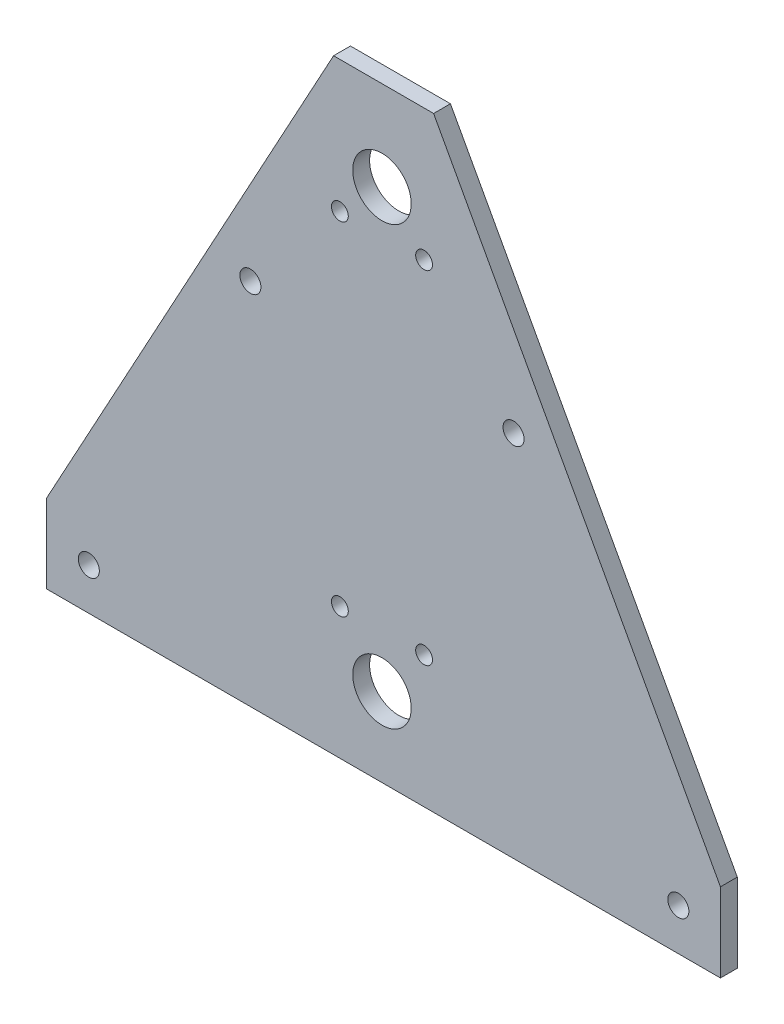
ISO-10303-21;
HEADER;
FILE_DESCRIPTION(('STEP AP214'),'2;1');
FILE_NAME('part.step','',(''),(''),'','','');
FILE_SCHEMA(('AUTOMOTIVE_DESIGN { 1 0 10303 214 1 1 1 1 }'));
ENDSEC;
DATA;
#1=APPLICATION_CONTEXT('core data for automotive mechanical design processes');
#2=APPLICATION_PROTOCOL_DEFINITION('international standard','automotive_design',2000,#1);
#3=PRODUCT_CONTEXT('',#1,'mechanical');
#4=PRODUCT('Part','Part','',(#3));
#5=PRODUCT_RELATED_PRODUCT_CATEGORY('part','',(#4));
#6=PRODUCT_DEFINITION_FORMATION('','',#4);
#7=PRODUCT_DEFINITION_CONTEXT('part definition',#1,'design');
#8=PRODUCT_DEFINITION('design','',#6,#7);
#9=PRODUCT_DEFINITION_SHAPE('','',#8);
#10=(LENGTH_UNIT() NAMED_UNIT(*) SI_UNIT(.MILLI.,.METRE.));
#11=(NAMED_UNIT(*) PLANE_ANGLE_UNIT() SI_UNIT($,.RADIAN.));
#12=(NAMED_UNIT(*) SI_UNIT($,.STERADIAN.) SOLID_ANGLE_UNIT());
#13=UNCERTAINTY_MEASURE_WITH_UNIT(LENGTH_MEASURE(1.E-05),#10,'distance_accuracy_value','');
#14=(GEOMETRIC_REPRESENTATION_CONTEXT(3) GLOBAL_UNCERTAINTY_ASSIGNED_CONTEXT((#13)) GLOBAL_UNIT_ASSIGNED_CONTEXT((#10,
#11,#12)) REPRESENTATION_CONTEXT('',''));
#15=CARTESIAN_POINT('',(0.,0.,0.));
#16=DIRECTION('',(0.,0.,1.));
#17=DIRECTION('',(1.,0.,0.));
#18=AXIS2_PLACEMENT_3D('',#15,#16,#17);
#19=CARTESIAN_POINT('',(0.,0.,16.));
#20=DIRECTION('',(0.,0.,1.));
#21=DIRECTION('',(1.,0.,0.));
#22=AXIS2_PLACEMENT_3D('',#19,#20,#21);
#23=PLANE('',#22);
#24=CARTESIAN_POINT('',(40.,39.7649052208436,16.));
#25=DIRECTION('',(0.,0.,1.));
#26=DIRECTION('',(1.,0.,0.));
#27=AXIS2_PLACEMENT_3D('',#24,#25,#26);
#28=CIRCLE('',#27,10.);
#29=CARTESIAN_POINT('',(50.,39.7649052208436,16.));
#30=VERTEX_POINT('',#29);
#31=EDGE_CURVE('E217',#30,#30,#28,.T.);
#32=ORIENTED_EDGE('',*,*,#31,.F.);
#33=EDGE_LOOP('',(#32));
#34=FACE_BOUND('',#33,.T.);
#35=CARTESIAN_POINT('',(358.476326100277,125.024449421026,16.));
#36=DIRECTION('',(0.,0.,1.));
#37=DIRECTION('',(1.,0.,0.));
#38=AXIS2_PLACEMENT_3D('',#35,#36,#37);
#39=CIRCLE('',#38,7.99999999999999);
#40=CARTESIAN_POINT('',(366.476326100277,125.024449421026,16.));
#41=VERTEX_POINT('',#40);
#42=EDGE_CURVE('E229',#41,#41,#39,.T.);
#43=ORIENTED_EDGE('',*,*,#42,.F.);
#44=EDGE_LOOP('',(#43));
#45=FACE_BOUND('',#44,.T.);
#46=CARTESIAN_POINT('',(443.476326100277,350.,16.));
#47=DIRECTION('',(0.,0.,1.));
#48=DIRECTION('',(1.,0.,0.));
#49=AXIS2_PLACEMENT_3D('',#46,#47,#48);
#50=CIRCLE('',#49,10.);
#51=CARTESIAN_POINT('',(453.476326100277,350.,16.));
#52=VERTEX_POINT('',#51);
#53=EDGE_CURVE('E241',#52,#52,#50,.T.);
#54=ORIENTED_EDGE('',*,*,#53,.F.);
#55=EDGE_LOOP('',(#54));
#56=FACE_BOUND('',#55,.T.);
#57=CARTESIAN_POINT('',(358.476326100277,450.,16.));
#58=DIRECTION('',(0.,0.,1.));
#59=DIRECTION('',(1.,0.,0.));
#60=AXIS2_PLACEMENT_3D('',#57,#58,#59);
#61=CIRCLE('',#60,7.99999999999999);
#62=CARTESIAN_POINT('',(366.476326100277,450.,16.));
#63=VERTEX_POINT('',#62);
#64=EDGE_CURVE('E253',#63,#63,#61,.T.);
#65=ORIENTED_EDGE('',*,*,#64,.F.);
#66=EDGE_LOOP('',(#65));
#67=FACE_BOUND('',#66,.T.);
#68=CARTESIAN_POINT('',(318.476326100277,490.,16.));
#69=DIRECTION('',(0.,0.,1.));
#70=DIRECTION('',(1.,0.,0.));
#71=AXIS2_PLACEMENT_3D('',#68,#69,#70);
#72=CIRCLE('',#71,27.775);
#73=CARTESIAN_POINT('',(346.251326100277,490.,16.));
#74=VERTEX_POINT('',#73);
#75=EDGE_CURVE('E126',#74,#74,#72,.T.);
#76=ORIENTED_EDGE('',*,*,#75,.F.);
#77=EDGE_LOOP('',(#76));
#78=FACE_BOUND('',#77,.T.);
#79=DIRECTION('',(0.,-1.,0.));
#80=VECTOR('',#79,1.);
#81=CARTESIAN_POINT('',(0.,75.,16.));
#82=LINE('',#81,#80);
#83=CARTESIAN_POINT('',(0.,75.,16.));
#84=VERTEX_POINT('',#83);
#85=CARTESIAN_POINT('',(0.,0.,16.));
#86=VERTEX_POINT('',#85);
#87=EDGE_CURVE('E133',#84,#86,#82,.T.);
#88=ORIENTED_EDGE('',*,*,#87,.T.);
#89=DIRECTION('',(1.,0.,0.));
#90=VECTOR('',#89,1.);
#91=CARTESIAN_POINT('',(0.,0.,16.));
#92=LINE('',#91,#90);
#93=CARTESIAN_POINT('',(640.,0.,16.));
#94=VERTEX_POINT('',#93);
#95=EDGE_CURVE('E91',#86,#94,#92,.T.);
#96=ORIENTED_EDGE('',*,*,#95,.T.);
#97=DIRECTION('',(0.,1.,0.));
#98=VECTOR('',#97,1.);
#99=CARTESIAN_POINT('',(640.,0.,16.));
#100=LINE('',#99,#98);
#101=CARTESIAN_POINT('',(640.,75.,16.));
#102=VERTEX_POINT('',#101);
#103=EDGE_CURVE('E104',#94,#102,#100,.T.);
#104=ORIENTED_EDGE('',*,*,#103,.T.);
#105=DIRECTION('',(-0.478530429270482,0.87807096994617,0.));
#106=VECTOR('',#105,1.);
#107=CARTESIAN_POINT('',(640.,75.,16.));
#108=LINE('',#107,#106);
#109=CARTESIAN_POINT('',(367.510391728463,575.,16.));
#110=VERTEX_POINT('',#109);
#111=EDGE_CURVE('E98',#102,#110,#108,.T.);
#112=ORIENTED_EDGE('',*,*,#111,.T.);
#113=DIRECTION('',(-1.,0.,0.));
#114=VECTOR('',#113,1.);
#115=CARTESIAN_POINT('',(367.510391728463,575.,16.));
#116=LINE('',#115,#114);
#117=CARTESIAN_POINT('',(272.510391728463,575.,16.));
#118=VERTEX_POINT('',#117);
#119=EDGE_CURVE('E102',#110,#118,#116,.T.);
#120=ORIENTED_EDGE('',*,*,#119,.T.);
#121=DIRECTION('',(-0.478558569346134,-0.878055633604945,0.));
#122=VECTOR('',#121,1.);
#123=CARTESIAN_POINT('',(272.510391728463,575.,16.));
#124=LINE('',#123,#122);
#125=EDGE_CURVE('E54',#118,#84,#124,.T.);
#126=ORIENTED_EDGE('',*,*,#125,.T.);
#127=EDGE_LOOP('',(#88,#96,#104,#112,#120,#126));
#128=FACE_BOUND('',#127,.T.);
#129=CARTESIAN_POINT('',(278.476326100277,450.,16.));
#130=DIRECTION('',(0.,0.,1.));
#131=DIRECTION('',(1.,0.,0.));
#132=AXIS2_PLACEMENT_3D('',#129,#130,#131);
#133=CIRCLE('',#132,7.99999999999999);
#134=CARTESIAN_POINT('',(286.476326100277,450.,16.));
#135=VERTEX_POINT('',#134);
#136=EDGE_CURVE('E259',#135,#135,#133,.T.);
#137=ORIENTED_EDGE('',*,*,#136,.F.);
#138=EDGE_LOOP('',(#137));
#139=FACE_BOUND('',#138,.T.);
#140=CARTESIAN_POINT('',(193.476326100277,350.,16.));
#141=DIRECTION('',(0.,0.,1.));
#142=DIRECTION('',(1.,0.,0.));
#143=AXIS2_PLACEMENT_3D('',#140,#141,#142);
#144=CIRCLE('',#143,10.);
#145=CARTESIAN_POINT('',(203.476326100277,350.,16.));
#146=VERTEX_POINT('',#145);
#147=EDGE_CURVE('E247',#146,#146,#144,.T.);
#148=ORIENTED_EDGE('',*,*,#147,.F.);
#149=EDGE_LOOP('',(#148));
#150=FACE_BOUND('',#149,.T.);
#151=CARTESIAN_POINT('',(278.476326100277,125.024449421026,16.));
#152=DIRECTION('',(0.,0.,1.));
#153=DIRECTION('',(1.,0.,0.));
#154=AXIS2_PLACEMENT_3D('',#151,#152,#153);
#155=CIRCLE('',#154,7.99999999999999);
#156=CARTESIAN_POINT('',(286.476326100277,125.024449421026,16.));
#157=VERTEX_POINT('',#156);
#158=EDGE_CURVE('E235',#157,#157,#155,.T.);
#159=ORIENTED_EDGE('',*,*,#158,.F.);
#160=EDGE_LOOP('',(#159));
#161=FACE_BOUND('',#160,.T.);
#162=CARTESIAN_POINT('',(318.476326100277,75.,16.));
#163=DIRECTION('',(0.,0.,1.));
#164=DIRECTION('',(1.,0.,0.));
#165=AXIS2_PLACEMENT_3D('',#162,#163,#164);
#166=CIRCLE('',#165,27.775);
#167=CARTESIAN_POINT('',(346.251326100277,75.,16.));
#168=VERTEX_POINT('',#167);
#169=EDGE_CURVE('E223',#168,#168,#166,.T.);
#170=ORIENTED_EDGE('',*,*,#169,.F.);
#171=EDGE_LOOP('',(#170));
#172=FACE_BOUND('',#171,.T.);
#173=CARTESIAN_POINT('',(600.,39.7649052208436,16.));
#174=DIRECTION('',(0.,0.,1.));
#175=DIRECTION('',(1.,0.,0.));
#176=AXIS2_PLACEMENT_3D('',#173,#174,#175);
#177=CIRCLE('',#176,9.99999999999998);
#178=CARTESIAN_POINT('',(610.,39.7649052208436,16.));
#179=VERTEX_POINT('',#178);
#180=EDGE_CURVE('E208',#179,#179,#177,.T.);
#181=ORIENTED_EDGE('',*,*,#180,.F.);
#182=EDGE_LOOP('',(#181));
#183=FACE_BOUND('',#182,.T.);
#184=ADVANCED_FACE('F37',(#34,#45,#56,#67,#78,#128,#139,#150,#161,#172,#183),#23,.T.);
#185=CARTESIAN_POINT('',(0.,0.,0.));
#186=DIRECTION('',(0.,0.,1.));
#187=DIRECTION('',(1.,0.,0.));
#188=AXIS2_PLACEMENT_3D('',#185,#186,#187);
#189=PLANE('',#188);
#190=DIRECTION('',(0.,-1.,0.));
#191=VECTOR('',#190,1.);
#192=CARTESIAN_POINT('',(0.,75.,0.));
#193=LINE('',#192,#191);
#194=CARTESIAN_POINT('',(0.,75.,0.));
#195=VERTEX_POINT('',#194);
#196=CARTESIAN_POINT('',(0.,0.,0.));
#197=VERTEX_POINT('',#196);
#198=EDGE_CURVE('E122',#195,#197,#193,.T.);
#199=ORIENTED_EDGE('',*,*,#198,.F.);
#200=DIRECTION('',(-0.478558569346134,-0.878055633604945,0.));
#201=VECTOR('',#200,1.);
#202=CARTESIAN_POINT('',(272.510391728463,575.,0.));
#203=LINE('',#202,#201);
#204=CARTESIAN_POINT('',(272.510391728463,575.,0.));
#205=VERTEX_POINT('',#204);
#206=EDGE_CURVE('E83',#205,#195,#203,.T.);
#207=ORIENTED_EDGE('',*,*,#206,.F.);
#208=DIRECTION('',(-1.,0.,0.));
#209=VECTOR('',#208,1.);
#210=CARTESIAN_POINT('',(367.510391728463,575.,0.));
#211=LINE('',#210,#209);
#212=CARTESIAN_POINT('',(367.510391728463,575.,0.));
#213=VERTEX_POINT('',#212);
#214=EDGE_CURVE('E77',#213,#205,#211,.T.);
#215=ORIENTED_EDGE('',*,*,#214,.F.);
#216=DIRECTION('',(-0.478530429270482,0.87807096994617,0.));
#217=VECTOR('',#216,1.);
#218=CARTESIAN_POINT('',(640.,75.,0.));
#219=LINE('',#218,#217);
#220=CARTESIAN_POINT('',(640.,75.,0.));
#221=VERTEX_POINT('',#220);
#222=EDGE_CURVE('E112',#221,#213,#219,.T.);
#223=ORIENTED_EDGE('',*,*,#222,.F.);
#224=DIRECTION('',(0.,1.,0.));
#225=VECTOR('',#224,1.);
#226=CARTESIAN_POINT('',(640.,0.,0.));
#227=LINE('',#226,#225);
#228=CARTESIAN_POINT('',(640.,0.,0.));
#229=VERTEX_POINT('',#228);
#230=EDGE_CURVE('E128',#229,#221,#227,.T.);
#231=ORIENTED_EDGE('',*,*,#230,.F.);
#232=DIRECTION('',(1.,0.,0.));
#233=VECTOR('',#232,1.);
#234=CARTESIAN_POINT('',(0.,0.,0.));
#235=LINE('',#234,#233);
#236=EDGE_CURVE('E125',#197,#229,#235,.T.);
#237=ORIENTED_EDGE('',*,*,#236,.F.);
#238=EDGE_LOOP('',(#199,#207,#215,#223,#231,#237));
#239=FACE_BOUND('',#238,.T.);
#240=CARTESIAN_POINT('',(318.476326100277,490.,0.));
#241=DIRECTION('',(0.,0.,1.));
#242=DIRECTION('',(1.,0.,0.));
#243=AXIS2_PLACEMENT_3D('',#240,#241,#242);
#244=CIRCLE('',#243,27.775);
#245=CARTESIAN_POINT('',(346.251326100277,490.,0.));
#246=VERTEX_POINT('',#245);
#247=EDGE_CURVE('E262',#246,#246,#244,.T.);
#248=ORIENTED_EDGE('',*,*,#247,.T.);
#249=EDGE_LOOP('',(#248));
#250=FACE_BOUND('',#249,.T.);
#251=CARTESIAN_POINT('',(278.476326100277,450.,0.));
#252=DIRECTION('',(0.,0.,1.));
#253=DIRECTION('',(1.,0.,0.));
#254=AXIS2_PLACEMENT_3D('',#251,#252,#253);
#255=CIRCLE('',#254,7.99999999999999);
#256=CARTESIAN_POINT('',(286.476326100277,450.,0.));
#257=VERTEX_POINT('',#256);
#258=EDGE_CURVE('E256',#257,#257,#255,.T.);
#259=ORIENTED_EDGE('',*,*,#258,.T.);
#260=EDGE_LOOP('',(#259));
#261=FACE_BOUND('',#260,.T.);
#262=CARTESIAN_POINT('',(358.476326100277,450.,0.));
#263=DIRECTION('',(0.,0.,1.));
#264=DIRECTION('',(1.,0.,0.));
#265=AXIS2_PLACEMENT_3D('',#262,#263,#264);
#266=CIRCLE('',#265,7.99999999999999);
#267=CARTESIAN_POINT('',(366.476326100277,450.,0.));
#268=VERTEX_POINT('',#267);
#269=EDGE_CURVE('E250',#268,#268,#266,.T.);
#270=ORIENTED_EDGE('',*,*,#269,.T.);
#271=EDGE_LOOP('',(#270));
#272=FACE_BOUND('',#271,.T.);
#273=CARTESIAN_POINT('',(193.476326100277,350.,0.));
#274=DIRECTION('',(0.,0.,1.));
#275=DIRECTION('',(1.,0.,0.));
#276=AXIS2_PLACEMENT_3D('',#273,#274,#275);
#277=CIRCLE('',#276,10.);
#278=CARTESIAN_POINT('',(203.476326100277,350.,0.));
#279=VERTEX_POINT('',#278);
#280=EDGE_CURVE('E244',#279,#279,#277,.T.);
#281=ORIENTED_EDGE('',*,*,#280,.T.);
#282=EDGE_LOOP('',(#281));
#283=FACE_BOUND('',#282,.T.);
#284=CARTESIAN_POINT('',(443.476326100277,350.,0.));
#285=DIRECTION('',(0.,0.,1.));
#286=DIRECTION('',(1.,0.,0.));
#287=AXIS2_PLACEMENT_3D('',#284,#285,#286);
#288=CIRCLE('',#287,10.);
#289=CARTESIAN_POINT('',(453.476326100277,350.,0.));
#290=VERTEX_POINT('',#289);
#291=EDGE_CURVE('E238',#290,#290,#288,.T.);
#292=ORIENTED_EDGE('',*,*,#291,.T.);
#293=EDGE_LOOP('',(#292));
#294=FACE_BOUND('',#293,.T.);
#295=CARTESIAN_POINT('',(278.476326100277,125.024449421026,0.));
#296=DIRECTION('',(0.,0.,1.));
#297=DIRECTION('',(1.,0.,0.));
#298=AXIS2_PLACEMENT_3D('',#295,#296,#297);
#299=CIRCLE('',#298,7.99999999999999);
#300=CARTESIAN_POINT('',(286.476326100277,125.024449421026,0.));
#301=VERTEX_POINT('',#300);
#302=EDGE_CURVE('E232',#301,#301,#299,.T.);
#303=ORIENTED_EDGE('',*,*,#302,.T.);
#304=EDGE_LOOP('',(#303));
#305=FACE_BOUND('',#304,.T.);
#306=CARTESIAN_POINT('',(358.476326100277,125.024449421026,0.));
#307=DIRECTION('',(0.,0.,1.));
#308=DIRECTION('',(1.,0.,0.));
#309=AXIS2_PLACEMENT_3D('',#306,#307,#308);
#310=CIRCLE('',#309,7.99999999999999);
#311=CARTESIAN_POINT('',(366.476326100277,125.024449421026,0.));
#312=VERTEX_POINT('',#311);
#313=EDGE_CURVE('E226',#312,#312,#310,.T.);
#314=ORIENTED_EDGE('',*,*,#313,.T.);
#315=EDGE_LOOP('',(#314));
#316=FACE_BOUND('',#315,.T.);
#317=CARTESIAN_POINT('',(318.476326100277,75.,0.));
#318=DIRECTION('',(0.,0.,1.));
#319=DIRECTION('',(1.,0.,0.));
#320=AXIS2_PLACEMENT_3D('',#317,#318,#319);
#321=CIRCLE('',#320,27.775);
#322=CARTESIAN_POINT('',(346.251326100277,75.,0.));
#323=VERTEX_POINT('',#322);
#324=EDGE_CURVE('E220',#323,#323,#321,.T.);
#325=ORIENTED_EDGE('',*,*,#324,.T.);
#326=EDGE_LOOP('',(#325));
#327=FACE_BOUND('',#326,.T.);
#328=CARTESIAN_POINT('',(40.,39.7649052208436,0.));
#329=DIRECTION('',(0.,0.,1.));
#330=DIRECTION('',(1.,0.,0.));
#331=AXIS2_PLACEMENT_3D('',#328,#329,#330);
#332=CIRCLE('',#331,10.);
#333=CARTESIAN_POINT('',(50.,39.7649052208436,0.));
#334=VERTEX_POINT('',#333);
#335=EDGE_CURVE('E214',#334,#334,#332,.T.);
#336=ORIENTED_EDGE('',*,*,#335,.T.);
#337=EDGE_LOOP('',(#336));
#338=FACE_BOUND('',#337,.T.);
#339=CARTESIAN_POINT('',(600.,39.7649052208436,0.));
#340=DIRECTION('',(0.,0.,1.));
#341=DIRECTION('',(1.,0.,0.));
#342=AXIS2_PLACEMENT_3D('',#339,#340,#341);
#343=CIRCLE('',#342,9.99999999999998);
#344=CARTESIAN_POINT('',(610.,39.7649052208436,0.));
#345=VERTEX_POINT('',#344);
#346=EDGE_CURVE('E211',#345,#345,#343,.T.);
#347=ORIENTED_EDGE('',*,*,#346,.T.);
#348=EDGE_LOOP('',(#347));
#349=FACE_BOUND('',#348,.T.);
#350=ADVANCED_FACE('F142',(#239,#250,#261,#272,#283,#294,#305,#316,#327,#338,#349),#189,.F.);
#351=CARTESIAN_POINT('',(0.,75.,16.));
#352=DIRECTION('',(1.,0.,0.));
#353=DIRECTION('',(0.,1.,0.));
#354=AXIS2_PLACEMENT_3D('',#351,#352,#353);
#355=PLANE('',#354);
#356=ORIENTED_EDGE('',*,*,#198,.T.);
#357=DIRECTION('',(0.,0.,-1.));
#358=VECTOR('',#357,1.);
#359=CARTESIAN_POINT('',(0.,0.,16.));
#360=LINE('',#359,#358);
#361=EDGE_CURVE('E11',#86,#197,#360,.T.);
#362=ORIENTED_EDGE('',*,*,#361,.F.);
#363=ORIENTED_EDGE('',*,*,#87,.F.);
#364=DIRECTION('',(0.,0.,-1.));
#365=VECTOR('',#364,1.);
#366=CARTESIAN_POINT('',(0.,75.,16.));
#367=LINE('',#366,#365);
#368=EDGE_CURVE('E118',#84,#195,#367,.T.);
#369=ORIENTED_EDGE('',*,*,#368,.T.);
#370=EDGE_LOOP('',(#356,#362,#363,#369));
#371=FACE_BOUND('',#370,.T.);
#372=ADVANCED_FACE('F39',(#371),#355,.F.);
#373=CARTESIAN_POINT('',(0.,0.,16.));
#374=DIRECTION('',(0.,1.,0.));
#375=DIRECTION('',(0.,0.,1.));
#376=AXIS2_PLACEMENT_3D('',#373,#374,#375);
#377=PLANE('',#376);
#378=ORIENTED_EDGE('',*,*,#236,.T.);
#379=DIRECTION('',(0.,0.,-1.));
#380=VECTOR('',#379,1.);
#381=CARTESIAN_POINT('',(640.,0.,16.));
#382=LINE('',#381,#380);
#383=EDGE_CURVE('E46',#94,#229,#382,.T.);
#384=ORIENTED_EDGE('',*,*,#383,.F.);
#385=ORIENTED_EDGE('',*,*,#95,.F.);
#386=ORIENTED_EDGE('',*,*,#361,.T.);
#387=EDGE_LOOP('',(#378,#384,#385,#386));
#388=FACE_BOUND('',#387,.T.);
#389=ADVANCED_FACE('F374',(#388),#377,.F.);
#390=CARTESIAN_POINT('',(640.,0.,16.));
#391=DIRECTION('',(-1.,0.,0.));
#392=DIRECTION('',(0.,0.,1.));
#393=AXIS2_PLACEMENT_3D('',#390,#391,#392);
#394=PLANE('',#393);
#395=ORIENTED_EDGE('',*,*,#230,.T.);
#396=DIRECTION('',(0.,0.,-1.));
#397=VECTOR('',#396,1.);
#398=CARTESIAN_POINT('',(640.,75.,16.));
#399=LINE('',#398,#397);
#400=EDGE_CURVE('E113',#102,#221,#399,.T.);
#401=ORIENTED_EDGE('',*,*,#400,.F.);
#402=ORIENTED_EDGE('',*,*,#103,.F.);
#403=ORIENTED_EDGE('',*,*,#383,.T.);
#404=EDGE_LOOP('',(#395,#401,#402,#403));
#405=FACE_BOUND('',#404,.T.);
#406=ADVANCED_FACE('F139',(#405),#394,.F.);
#407=CARTESIAN_POINT('',(640.,75.,16.));
#408=DIRECTION('',(-0.87807096994617,-0.478530429270482,0.));
#409=DIRECTION('',(0.478530429270482,-0.87807096994617,0.));
#410=AXIS2_PLACEMENT_3D('',#407,#408,#409);
#411=PLANE('',#410);
#412=ORIENTED_EDGE('',*,*,#222,.T.);
#413=DIRECTION('',(0.,0.,-1.));
#414=VECTOR('',#413,1.);
#415=CARTESIAN_POINT('',(367.510391728463,575.,16.));
#416=LINE('',#415,#414);
#417=EDGE_CURVE('E109',#110,#213,#416,.T.);
#418=ORIENTED_EDGE('',*,*,#417,.F.);
#419=ORIENTED_EDGE('',*,*,#111,.F.);
#420=ORIENTED_EDGE('',*,*,#400,.T.);
#421=EDGE_LOOP('',(#412,#418,#419,#420));
#422=FACE_BOUND('',#421,.T.);
#423=ADVANCED_FACE('F110',(#422),#411,.F.);
#424=CARTESIAN_POINT('',(367.510391728463,575.,16.));
#425=DIRECTION('',(0.,-1.,0.));
#426=DIRECTION('',(1.,0.,0.));
#427=AXIS2_PLACEMENT_3D('',#424,#425,#426);
#428=PLANE('',#427);
#429=ORIENTED_EDGE('',*,*,#214,.T.);
#430=DIRECTION('',(0.,0.,-1.));
#431=VECTOR('',#430,1.);
#432=CARTESIAN_POINT('',(272.510391728463,575.,16.));
#433=LINE('',#432,#431);
#434=EDGE_CURVE('E114',#118,#205,#433,.T.);
#435=ORIENTED_EDGE('',*,*,#434,.F.);
#436=ORIENTED_EDGE('',*,*,#119,.F.);
#437=ORIENTED_EDGE('',*,*,#417,.T.);
#438=EDGE_LOOP('',(#429,#435,#436,#437));
#439=FACE_BOUND('',#438,.T.);
#440=ADVANCED_FACE('F116',(#439),#428,.F.);
#441=CARTESIAN_POINT('',(272.510391728463,575.,16.));
#442=DIRECTION('',(0.878055633604945,-0.478558569346134,0.));
#443=DIRECTION('',(0.478558569346134,0.878055633604945,0.));
#444=AXIS2_PLACEMENT_3D('',#441,#442,#443);
#445=PLANE('',#444);
#446=ORIENTED_EDGE('',*,*,#206,.T.);
#447=ORIENTED_EDGE('',*,*,#368,.F.);
#448=ORIENTED_EDGE('',*,*,#125,.F.);
#449=ORIENTED_EDGE('',*,*,#434,.T.);
#450=EDGE_LOOP('',(#446,#447,#448,#449));
#451=FACE_BOUND('',#450,.T.);
#452=ADVANCED_FACE('F147',(#451),#445,.F.);
#453=CARTESIAN_POINT('',(318.476326100277,490.,16.));
#454=DIRECTION('',(0.,0.,-1.));
#455=DIRECTION('',(-1.,0.,0.));
#456=AXIS2_PLACEMENT_3D('',#453,#454,#455);
#457=CYLINDRICAL_SURFACE('',#456,27.775);
#458=ORIENTED_EDGE('',*,*,#75,.T.);
#459=EDGE_LOOP('',(#458));
#460=FACE_BOUND('',#459,.T.);
#461=ORIENTED_EDGE('',*,*,#247,.F.);
#462=EDGE_LOOP('',(#461));
#463=FACE_BOUND('',#462,.T.);
#464=ADVANCED_FACE('F149',(#460,#463),#457,.F.);
#465=CARTESIAN_POINT('',(278.476326100277,450.,16.));
#466=DIRECTION('',(0.,0.,-1.));
#467=DIRECTION('',(-1.,0.,0.));
#468=AXIS2_PLACEMENT_3D('',#465,#466,#467);
#469=CYLINDRICAL_SURFACE('',#468,7.99999999999999);
#470=ORIENTED_EDGE('',*,*,#136,.T.);
#471=EDGE_LOOP('',(#470));
#472=FACE_BOUND('',#471,.T.);
#473=ORIENTED_EDGE('',*,*,#258,.F.);
#474=EDGE_LOOP('',(#473));
#475=FACE_BOUND('',#474,.T.);
#476=ADVANCED_FACE('F155',(#472,#475),#469,.F.);
#477=CARTESIAN_POINT('',(358.476326100277,450.,16.));
#478=DIRECTION('',(0.,0.,-1.));
#479=DIRECTION('',(-1.,0.,0.));
#480=AXIS2_PLACEMENT_3D('',#477,#478,#479);
#481=CYLINDRICAL_SURFACE('',#480,7.99999999999999);
#482=ORIENTED_EDGE('',*,*,#64,.T.);
#483=EDGE_LOOP('',(#482));
#484=FACE_BOUND('',#483,.T.);
#485=ORIENTED_EDGE('',*,*,#269,.F.);
#486=EDGE_LOOP('',(#485));
#487=FACE_BOUND('',#486,.T.);
#488=ADVANCED_FACE('F171',(#484,#487),#481,.F.);
#489=CARTESIAN_POINT('',(193.476326100277,350.,16.));
#490=DIRECTION('',(0.,0.,-1.));
#491=DIRECTION('',(-1.,0.,0.));
#492=AXIS2_PLACEMENT_3D('',#489,#490,#491);
#493=CYLINDRICAL_SURFACE('',#492,10.);
#494=ORIENTED_EDGE('',*,*,#147,.T.);
#495=EDGE_LOOP('',(#494));
#496=FACE_BOUND('',#495,.T.);
#497=ORIENTED_EDGE('',*,*,#280,.F.);
#498=EDGE_LOOP('',(#497));
#499=FACE_BOUND('',#498,.T.);
#500=ADVANCED_FACE('F175',(#496,#499),#493,.F.);
#501=CARTESIAN_POINT('',(443.476326100277,350.,16.));
#502=DIRECTION('',(0.,0.,-1.));
#503=DIRECTION('',(-1.,0.,0.));
#504=AXIS2_PLACEMENT_3D('',#501,#502,#503);
#505=CYLINDRICAL_SURFACE('',#504,10.);
#506=ORIENTED_EDGE('',*,*,#53,.T.);
#507=EDGE_LOOP('',(#506));
#508=FACE_BOUND('',#507,.T.);
#509=ORIENTED_EDGE('',*,*,#291,.F.);
#510=EDGE_LOOP('',(#509));
#511=FACE_BOUND('',#510,.T.);
#512=ADVANCED_FACE('F179',(#508,#511),#505,.F.);
#513=CARTESIAN_POINT('',(278.476326100277,125.024449421026,16.));
#514=DIRECTION('',(0.,0.,-1.));
#515=DIRECTION('',(-1.,0.,0.));
#516=AXIS2_PLACEMENT_3D('',#513,#514,#515);
#517=CYLINDRICAL_SURFACE('',#516,7.99999999999999);
#518=ORIENTED_EDGE('',*,*,#158,.T.);
#519=EDGE_LOOP('',(#518));
#520=FACE_BOUND('',#519,.T.);
#521=ORIENTED_EDGE('',*,*,#302,.F.);
#522=EDGE_LOOP('',(#521));
#523=FACE_BOUND('',#522,.T.);
#524=ADVANCED_FACE('F183',(#520,#523),#517,.F.);
#525=CARTESIAN_POINT('',(358.476326100277,125.024449421026,16.));
#526=DIRECTION('',(0.,0.,-1.));
#527=DIRECTION('',(-1.,0.,0.));
#528=AXIS2_PLACEMENT_3D('',#525,#526,#527);
#529=CYLINDRICAL_SURFACE('',#528,7.99999999999999);
#530=ORIENTED_EDGE('',*,*,#42,.T.);
#531=EDGE_LOOP('',(#530));
#532=FACE_BOUND('',#531,.T.);
#533=ORIENTED_EDGE('',*,*,#313,.F.);
#534=EDGE_LOOP('',(#533));
#535=FACE_BOUND('',#534,.T.);
#536=ADVANCED_FACE('F187',(#532,#535),#529,.F.);
#537=CARTESIAN_POINT('',(318.476326100277,75.,16.));
#538=DIRECTION('',(0.,0.,-1.));
#539=DIRECTION('',(-1.,0.,0.));
#540=AXIS2_PLACEMENT_3D('',#537,#538,#539);
#541=CYLINDRICAL_SURFACE('',#540,27.775);
#542=ORIENTED_EDGE('',*,*,#169,.T.);
#543=EDGE_LOOP('',(#542));
#544=FACE_BOUND('',#543,.T.);
#545=ORIENTED_EDGE('',*,*,#324,.F.);
#546=EDGE_LOOP('',(#545));
#547=FACE_BOUND('',#546,.T.);
#548=ADVANCED_FACE('F191',(#544,#547),#541,.F.);
#549=CARTESIAN_POINT('',(40.,39.7649052208436,16.));
#550=DIRECTION('',(0.,0.,-1.));
#551=DIRECTION('',(-1.,0.,0.));
#552=AXIS2_PLACEMENT_3D('',#549,#550,#551);
#553=CYLINDRICAL_SURFACE('',#552,10.);
#554=ORIENTED_EDGE('',*,*,#31,.T.);
#555=EDGE_LOOP('',(#554));
#556=FACE_BOUND('',#555,.T.);
#557=ORIENTED_EDGE('',*,*,#335,.F.);
#558=EDGE_LOOP('',(#557));
#559=FACE_BOUND('',#558,.T.);
#560=ADVANCED_FACE('F195',(#556,#559),#553,.F.);
#561=CARTESIAN_POINT('',(600.,39.7649052208436,16.));
#562=DIRECTION('',(0.,0.,-1.));
#563=DIRECTION('',(-1.,0.,0.));
#564=AXIS2_PLACEMENT_3D('',#561,#562,#563);
#565=CYLINDRICAL_SURFACE('',#564,9.99999999999998);
#566=ORIENTED_EDGE('',*,*,#180,.T.);
#567=EDGE_LOOP('',(#566));
#568=FACE_BOUND('',#567,.T.);
#569=ORIENTED_EDGE('',*,*,#346,.F.);
#570=EDGE_LOOP('',(#569));
#571=FACE_BOUND('',#570,.T.);
#572=ADVANCED_FACE('F199',(#568,#571),#565,.F.);
#573=CLOSED_SHELL('',(#184,#350,#372,#389,#406,#423,#440,#452,#464,#476,#488,#500,#512,#524,
#536,#548,#560,#572));
#574=MANIFOLD_SOLID_BREP('B2',#573);
#575=ADVANCED_BREP_SHAPE_REPRESENTATION('',(#18,#574),#14);
#576=SHAPE_DEFINITION_REPRESENTATION(#9,#575);
ENDSEC;
END-ISO-10303-21;
